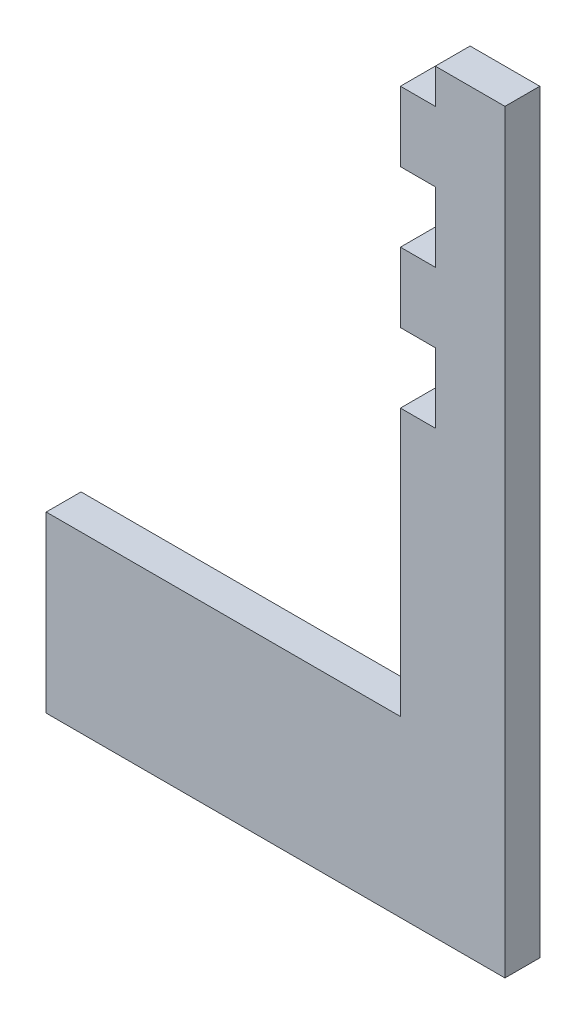
ISO-10303-21;
HEADER;
FILE_DESCRIPTION(('STEP AP214'),'2;1');
FILE_NAME('part.step','',(''),(''),'','','');
FILE_SCHEMA(('AUTOMOTIVE_DESIGN { 1 0 10303 214 1 1 1 1 }'));
ENDSEC;
DATA;
#1=APPLICATION_CONTEXT('core data for automotive mechanical design processes');
#2=APPLICATION_PROTOCOL_DEFINITION('international standard','automotive_design',2000,#1);
#3=PRODUCT_CONTEXT('',#1,'mechanical');
#4=PRODUCT('Part','Part','',(#3));
#5=PRODUCT_RELATED_PRODUCT_CATEGORY('part','',(#4));
#6=PRODUCT_DEFINITION_FORMATION('','',#4);
#7=PRODUCT_DEFINITION_CONTEXT('part definition',#1,'design');
#8=PRODUCT_DEFINITION('design','',#6,#7);
#9=PRODUCT_DEFINITION_SHAPE('','',#8);
#10=(LENGTH_UNIT() NAMED_UNIT(*) SI_UNIT(.MILLI.,.METRE.));
#11=(NAMED_UNIT(*) PLANE_ANGLE_UNIT() SI_UNIT($,.RADIAN.));
#12=(NAMED_UNIT(*) SI_UNIT($,.STERADIAN.) SOLID_ANGLE_UNIT());
#13=UNCERTAINTY_MEASURE_WITH_UNIT(LENGTH_MEASURE(1.E-05),#10,'distance_accuracy_value','');
#14=(GEOMETRIC_REPRESENTATION_CONTEXT(3) GLOBAL_UNCERTAINTY_ASSIGNED_CONTEXT((#13)) GLOBAL_UNIT_ASSIGNED_CONTEXT((#10,
#11,#12)) REPRESENTATION_CONTEXT('',''));
#15=CARTESIAN_POINT('',(0.,0.,0.));
#16=DIRECTION('',(0.,0.,1.));
#17=DIRECTION('',(1.,0.,0.));
#18=AXIS2_PLACEMENT_3D('',#15,#16,#17);
#19=CARTESIAN_POINT('',(61.,0.,6.));
#20=DIRECTION('',(-1.,0.,0.));
#21=DIRECTION('',(0.,0.,1.));
#22=AXIS2_PLACEMENT_3D('',#19,#20,#21);
#23=PLANE('',#22);
#24=DIRECTION('',(0.,0.,-1.));
#25=VECTOR('',#24,1.);
#26=CARTESIAN_POINT('',(61.,94.,6.001));
#27=LINE('',#26,#25);
#28=CARTESIAN_POINT('',(61.,94.,6.));
#29=VERTEX_POINT('',#28);
#30=CARTESIAN_POINT('',(61.,94.,0.));
#31=VERTEX_POINT('',#30);
#32=EDGE_CURVE('E157',#29,#31,#27,.T.);
#33=ORIENTED_EDGE('',*,*,#32,.T.);
#34=DIRECTION('',(0.,1.,0.));
#35=VECTOR('',#34,1.);
#36=CARTESIAN_POINT('',(61.,0.,0.));
#37=LINE('',#36,#35);
#38=CARTESIAN_POINT('',(60.9999999999998,82.,0.));
#39=VERTEX_POINT('',#38);
#40=EDGE_CURVE('E184',#39,#31,#37,.T.);
#41=ORIENTED_EDGE('',*,*,#40,.F.);
#42=DIRECTION('',(0.,0.,-1.));
#43=VECTOR('',#42,1.);
#44=CARTESIAN_POINT('',(60.9999999999998,82.,6.001));
#45=LINE('',#44,#43);
#46=CARTESIAN_POINT('',(61.,82.,6.));
#47=VERTEX_POINT('',#46);
#48=EDGE_CURVE('E254',#47,#39,#45,.T.);
#49=ORIENTED_EDGE('',*,*,#48,.F.);
#50=DIRECTION('',(0.,1.,0.));
#51=VECTOR('',#50,1.);
#52=CARTESIAN_POINT('',(61.,0.,6.));
#53=LINE('',#52,#51);
#54=EDGE_CURVE('E186',#47,#29,#53,.T.);
#55=ORIENTED_EDGE('',*,*,#54,.T.);
#56=EDGE_LOOP('',(#33,#41,#49,#55));
#57=FACE_BOUND('',#56,.T.);
#58=ADVANCED_FACE('F35',(#57),#23,.T.);
#59=DIRECTION('',(0.,0.,-1.));
#60=VECTOR('',#59,1.);
#61=CARTESIAN_POINT('',(60.9999999999998,70.,6.001));
#62=LINE('',#61,#60);
#63=CARTESIAN_POINT('',(61.,70.,6.));
#64=VERTEX_POINT('',#63);
#65=CARTESIAN_POINT('',(60.9999999999998,70.,0.));
#66=VERTEX_POINT('',#65);
#67=EDGE_CURVE('E251',#64,#66,#62,.T.);
#68=ORIENTED_EDGE('',*,*,#67,.T.);
#69=CARTESIAN_POINT('',(60.9999999999995,58.,0.));
#70=VERTEX_POINT('',#69);
#71=EDGE_CURVE('E183',#70,#66,#37,.T.);
#72=ORIENTED_EDGE('',*,*,#71,.F.);
#73=DIRECTION('',(0.,0.,-1.));
#74=VECTOR('',#73,1.);
#75=CARTESIAN_POINT('',(60.9999999999995,58.,6.001));
#76=LINE('',#75,#74);
#77=CARTESIAN_POINT('',(61.,58.,6.));
#78=VERTEX_POINT('',#77);
#79=EDGE_CURVE('E249',#78,#70,#76,.T.);
#80=ORIENTED_EDGE('',*,*,#79,.F.);
#81=EDGE_CURVE('E188',#78,#64,#53,.T.);
#82=ORIENTED_EDGE('',*,*,#81,.T.);
#83=EDGE_LOOP('',(#68,#72,#80,#82));
#84=FACE_BOUND('',#83,.T.);
#85=ADVANCED_FACE('F248',(#84),#23,.T.);
#86=DIRECTION('',(0.,0.,-1.));
#87=VECTOR('',#86,1.);
#88=CARTESIAN_POINT('',(60.9999999999995,46.,6.001));
#89=LINE('',#88,#87);
#90=CARTESIAN_POINT('',(61.,46.,6.));
#91=VERTEX_POINT('',#90);
#92=CARTESIAN_POINT('',(60.9999999999995,46.,0.));
#93=VERTEX_POINT('',#92);
#94=EDGE_CURVE('E199',#91,#93,#89,.T.);
#95=ORIENTED_EDGE('',*,*,#94,.T.);
#96=CARTESIAN_POINT('',(61.,0.,0.));
#97=VERTEX_POINT('',#96);
#98=EDGE_CURVE('E179',#97,#93,#37,.T.);
#99=ORIENTED_EDGE('',*,*,#98,.F.);
#100=DIRECTION('',(0.,0.,-1.));
#101=VECTOR('',#100,1.);
#102=CARTESIAN_POINT('',(61.,0.,6.));
#103=LINE('',#102,#101);
#104=CARTESIAN_POINT('',(61.,0.,6.));
#105=VERTEX_POINT('',#104);
#106=EDGE_CURVE('E11',#105,#97,#103,.T.);
#107=ORIENTED_EDGE('',*,*,#106,.F.);
#108=EDGE_CURVE('E175',#105,#91,#53,.T.);
#109=ORIENTED_EDGE('',*,*,#108,.T.);
#110=EDGE_LOOP('',(#95,#99,#107,#109));
#111=FACE_BOUND('',#110,.T.);
#112=ADVANCED_FACE('F37',(#111),#23,.T.);
#113=CARTESIAN_POINT('',(79.,0.,6.));
#114=DIRECTION('',(-1.,0.,0.));
#115=DIRECTION('',(0.,0.,1.));
#116=AXIS2_PLACEMENT_3D('',#113,#114,#115);
#117=PLANE('',#116);
#118=DIRECTION('',(0.,1.,0.));
#119=VECTOR('',#118,1.);
#120=CARTESIAN_POINT('',(79.,0.,0.));
#121=LINE('',#120,#119);
#122=CARTESIAN_POINT('',(79.,-30.,0.));
#123=VERTEX_POINT('',#122);
#124=CARTESIAN_POINT('',(79.,100.,0.));
#125=VERTEX_POINT('',#124);
#126=EDGE_CURVE('E182',#123,#125,#121,.T.);
#127=ORIENTED_EDGE('',*,*,#126,.T.);
#128=DIRECTION('',(0.,0.,-1.));
#129=VECTOR('',#128,1.);
#130=CARTESIAN_POINT('',(79.,100.,6.));
#131=LINE('',#130,#129);
#132=CARTESIAN_POINT('',(79.,100.,6.));
#133=VERTEX_POINT('',#132);
#134=EDGE_CURVE('E43',#133,#125,#131,.T.);
#135=ORIENTED_EDGE('',*,*,#134,.F.);
#136=DIRECTION('',(0.,1.,0.));
#137=VECTOR('',#136,1.);
#138=CARTESIAN_POINT('',(79.,0.,6.));
#139=LINE('',#138,#137);
#140=CARTESIAN_POINT('',(79.,-30.,6.));
#141=VERTEX_POINT('',#140);
#142=EDGE_CURVE('E172',#141,#133,#139,.T.);
#143=ORIENTED_EDGE('',*,*,#142,.F.);
#144=DIRECTION('',(0.,0.,-1.));
#145=VECTOR('',#144,1.);
#146=CARTESIAN_POINT('',(79.,-30.,6.));
#147=LINE('',#146,#145);
#148=EDGE_CURVE('E228',#141,#123,#147,.T.);
#149=ORIENTED_EDGE('',*,*,#148,.T.);
#150=EDGE_LOOP('',(#127,#135,#143,#149));
#151=FACE_BOUND('',#150,.T.);
#152=ADVANCED_FACE('F305',(#151),#117,.F.);
#153=CARTESIAN_POINT('',(0.,100.,6.));
#154=DIRECTION('',(0.,-1.,0.));
#155=DIRECTION('',(0.,0.,-1.));
#156=AXIS2_PLACEMENT_3D('',#153,#154,#155);
#157=PLANE('',#156);
#158=DIRECTION('',(-1.,0.,0.));
#159=VECTOR('',#158,1.);
#160=CARTESIAN_POINT('',(0.,100.,0.));
#161=LINE('',#160,#159);
#162=CARTESIAN_POINT('',(67.,100.,0.));
#163=VERTEX_POINT('',#162);
#164=EDGE_CURVE('E166',#125,#163,#161,.T.);
#165=ORIENTED_EDGE('',*,*,#164,.T.);
#166=DIRECTION('',(0.,0.,-1.));
#167=VECTOR('',#166,1.);
#168=CARTESIAN_POINT('',(67.,100.,6.001));
#169=LINE('',#168,#167);
#170=CARTESIAN_POINT('',(67.,100.,6.));
#171=VERTEX_POINT('',#170);
#172=EDGE_CURVE('E151',#171,#163,#169,.T.);
#173=ORIENTED_EDGE('',*,*,#172,.F.);
#174=DIRECTION('',(-1.,0.,0.));
#175=VECTOR('',#174,1.);
#176=CARTESIAN_POINT('',(0.,100.,6.));
#177=LINE('',#176,#175);
#178=EDGE_CURVE('E164',#133,#171,#177,.T.);
#179=ORIENTED_EDGE('',*,*,#178,.F.);
#180=ORIENTED_EDGE('',*,*,#134,.T.);
#181=EDGE_LOOP('',(#165,#173,#179,#180));
#182=FACE_BOUND('',#181,.T.);
#183=ADVANCED_FACE('F162',(#182),#157,.F.);
#184=CARTESIAN_POINT('',(0.,0.,6.));
#185=DIRECTION('',(0.,0.,1.));
#186=DIRECTION('',(1.,0.,0.));
#187=AXIS2_PLACEMENT_3D('',#184,#185,#186);
#188=PLANE('',#187);
#189=DIRECTION('',(0.,-1.,0.));
#190=VECTOR('',#189,1.);
#191=CARTESIAN_POINT('',(67.,106.,6.));
#192=LINE('',#191,#190);
#193=CARTESIAN_POINT('',(67.,94.,6.));
#194=VERTEX_POINT('',#193);
#195=EDGE_CURVE('E148',#171,#194,#192,.T.);
#196=ORIENTED_EDGE('',*,*,#195,.T.);
#197=DIRECTION('',(-1.,0.,0.));
#198=VECTOR('',#197,1.);
#199=CARTESIAN_POINT('',(61.,94.,6.));
#200=LINE('',#199,#198);
#201=EDGE_CURVE('E167',#194,#29,#200,.T.);
#202=ORIENTED_EDGE('',*,*,#201,.T.);
#203=ORIENTED_EDGE('',*,*,#54,.F.);
#204=DIRECTION('',(1.,0.,0.));
#205=VECTOR('',#204,1.);
#206=CARTESIAN_POINT('',(60.9999999999998,82.,6.));
#207=LINE('',#206,#205);
#208=CARTESIAN_POINT('',(66.9999999999998,82.,6.));
#209=VERTEX_POINT('',#208);
#210=EDGE_CURVE('E283',#47,#209,#207,.T.);
#211=ORIENTED_EDGE('',*,*,#210,.T.);
#212=DIRECTION('',(0.,-1.,0.));
#213=VECTOR('',#212,1.);
#214=CARTESIAN_POINT('',(66.9999999999998,82.,6.));
#215=LINE('',#214,#213);
#216=CARTESIAN_POINT('',(66.9999999999998,70.,6.));
#217=VERTEX_POINT('',#216);
#218=EDGE_CURVE('E168',#209,#217,#215,.T.);
#219=ORIENTED_EDGE('',*,*,#218,.T.);
#220=DIRECTION('',(-1.,0.,0.));
#221=VECTOR('',#220,1.);
#222=CARTESIAN_POINT('',(60.9999999999998,70.,6.));
#223=LINE('',#222,#221);
#224=EDGE_CURVE('E282',#217,#64,#223,.T.);
#225=ORIENTED_EDGE('',*,*,#224,.T.);
#226=ORIENTED_EDGE('',*,*,#81,.F.);
#227=DIRECTION('',(1.,0.,0.));
#228=VECTOR('',#227,1.);
#229=CARTESIAN_POINT('',(60.9999999999995,58.,6.));
#230=LINE('',#229,#228);
#231=CARTESIAN_POINT('',(66.9999999999995,58.,6.));
#232=VERTEX_POINT('',#231);
#233=EDGE_CURVE('E266',#78,#232,#230,.T.);
#234=ORIENTED_EDGE('',*,*,#233,.T.);
#235=DIRECTION('',(0.,-1.,0.));
#236=VECTOR('',#235,1.);
#237=CARTESIAN_POINT('',(66.9999999999995,58.,6.));
#238=LINE('',#237,#236);
#239=CARTESIAN_POINT('',(66.9999999999995,46.,6.));
#240=VERTEX_POINT('',#239);
#241=EDGE_CURVE('E277',#232,#240,#238,.T.);
#242=ORIENTED_EDGE('',*,*,#241,.T.);
#243=DIRECTION('',(-1.,0.,0.));
#244=VECTOR('',#243,1.);
#245=CARTESIAN_POINT('',(60.9999999999995,46.,6.));
#246=LINE('',#245,#244);
#247=EDGE_CURVE('E205',#240,#91,#246,.T.);
#248=ORIENTED_EDGE('',*,*,#247,.T.);
#249=ORIENTED_EDGE('',*,*,#108,.F.);
#250=DIRECTION('',(-1.,0.,0.));
#251=VECTOR('',#250,1.);
#252=CARTESIAN_POINT('',(0.,0.,6.));
#253=LINE('',#252,#251);
#254=CARTESIAN_POINT('',(0.,0.,6.));
#255=VERTEX_POINT('',#254);
#256=EDGE_CURVE('E202',#105,#255,#253,.T.);
#257=ORIENTED_EDGE('',*,*,#256,.T.);
#258=DIRECTION('',(0.,-1.,0.));
#259=VECTOR('',#258,1.);
#260=CARTESIAN_POINT('',(0.,0.,6.));
#261=LINE('',#260,#259);
#262=CARTESIAN_POINT('',(0.,-30.,6.));
#263=VERTEX_POINT('',#262);
#264=EDGE_CURVE('E212',#255,#263,#261,.T.);
#265=ORIENTED_EDGE('',*,*,#264,.T.);
#266=DIRECTION('',(1.,0.,0.));
#267=VECTOR('',#266,1.);
#268=CARTESIAN_POINT('',(0.,-30.,6.));
#269=LINE('',#268,#267);
#270=EDGE_CURVE('E213',#263,#141,#269,.T.);
#271=ORIENTED_EDGE('',*,*,#270,.T.);
#272=ORIENTED_EDGE('',*,*,#142,.T.);
#273=ORIENTED_EDGE('',*,*,#178,.T.);
#274=EDGE_LOOP('',(#196,#202,#203,#211,#219,#225,#226,#234,#242,#248,#249,#257,#265,#271,#272,#273));
#275=FACE_BOUND('',#274,.T.);
#276=ADVANCED_FACE('F170',(#275),#188,.T.);
#277=CARTESIAN_POINT('',(0.,0.,0.));
#278=DIRECTION('',(0.,0.,1.));
#279=DIRECTION('',(1.,0.,0.));
#280=AXIS2_PLACEMENT_3D('',#277,#278,#279);
#281=PLANE('',#280);
#282=DIRECTION('',(-1.,0.,0.));
#283=VECTOR('',#282,1.);
#284=CARTESIAN_POINT('',(61.,94.,0.));
#285=LINE('',#284,#283);
#286=CARTESIAN_POINT('',(67.,94.,0.));
#287=VERTEX_POINT('',#286);
#288=EDGE_CURVE('E298',#287,#31,#285,.T.);
#289=ORIENTED_EDGE('',*,*,#288,.F.);
#290=DIRECTION('',(0.,-1.,0.));
#291=VECTOR('',#290,1.);
#292=CARTESIAN_POINT('',(67.,106.,0.));
#293=LINE('',#292,#291);
#294=EDGE_CURVE('E50',#163,#287,#293,.T.);
#295=ORIENTED_EDGE('',*,*,#294,.F.);
#296=ORIENTED_EDGE('',*,*,#164,.F.);
#297=ORIENTED_EDGE('',*,*,#126,.F.);
#298=DIRECTION('',(1.,0.,0.));
#299=VECTOR('',#298,1.);
#300=CARTESIAN_POINT('',(0.,-30.,0.));
#301=LINE('',#300,#299);
#302=CARTESIAN_POINT('',(0.,-30.,0.));
#303=VERTEX_POINT('',#302);
#304=EDGE_CURVE('E156',#303,#123,#301,.T.);
#305=ORIENTED_EDGE('',*,*,#304,.F.);
#306=DIRECTION('',(0.,-1.,0.));
#307=VECTOR('',#306,1.);
#308=CARTESIAN_POINT('',(0.,0.,0.));
#309=LINE('',#308,#307);
#310=CARTESIAN_POINT('',(0.,0.,0.));
#311=VERTEX_POINT('',#310);
#312=EDGE_CURVE('E217',#311,#303,#309,.T.);
#313=ORIENTED_EDGE('',*,*,#312,.F.);
#314=DIRECTION('',(-1.,0.,0.));
#315=VECTOR('',#314,1.);
#316=CARTESIAN_POINT('',(0.,0.,0.));
#317=LINE('',#316,#315);
#318=EDGE_CURVE('E223',#97,#311,#317,.T.);
#319=ORIENTED_EDGE('',*,*,#318,.F.);
#320=ORIENTED_EDGE('',*,*,#98,.T.);
#321=DIRECTION('',(-1.,0.,0.));
#322=VECTOR('',#321,1.);
#323=CARTESIAN_POINT('',(60.9999999999995,46.,0.));
#324=LINE('',#323,#322);
#325=CARTESIAN_POINT('',(66.9999999999995,46.,0.));
#326=VERTEX_POINT('',#325);
#327=EDGE_CURVE('E273',#326,#93,#324,.T.);
#328=ORIENTED_EDGE('',*,*,#327,.F.);
#329=DIRECTION('',(0.,-1.,0.));
#330=VECTOR('',#329,1.);
#331=CARTESIAN_POINT('',(66.9999999999995,58.,0.));
#332=LINE('',#331,#330);
#333=CARTESIAN_POINT('',(66.9999999999995,58.,0.));
#334=VERTEX_POINT('',#333);
#335=EDGE_CURVE('E270',#334,#326,#332,.T.);
#336=ORIENTED_EDGE('',*,*,#335,.F.);
#337=DIRECTION('',(1.,0.,0.));
#338=VECTOR('',#337,1.);
#339=CARTESIAN_POINT('',(60.9999999999995,58.,0.));
#340=LINE('',#339,#338);
#341=EDGE_CURVE('E244',#70,#334,#340,.T.);
#342=ORIENTED_EDGE('',*,*,#341,.F.);
#343=ORIENTED_EDGE('',*,*,#71,.T.);
#344=DIRECTION('',(-1.,0.,0.));
#345=VECTOR('',#344,1.);
#346=CARTESIAN_POINT('',(60.9999999999998,70.,0.));
#347=LINE('',#346,#345);
#348=CARTESIAN_POINT('',(66.9999999999998,70.,0.));
#349=VERTEX_POINT('',#348);
#350=EDGE_CURVE('E242',#349,#66,#347,.T.);
#351=ORIENTED_EDGE('',*,*,#350,.F.);
#352=DIRECTION('',(0.,-1.,0.));
#353=VECTOR('',#352,1.);
#354=CARTESIAN_POINT('',(66.9999999999998,82.,0.));
#355=LINE('',#354,#353);
#356=CARTESIAN_POINT('',(66.9999999999998,82.,0.));
#357=VERTEX_POINT('',#356);
#358=EDGE_CURVE('E290',#357,#349,#355,.T.);
#359=ORIENTED_EDGE('',*,*,#358,.F.);
#360=DIRECTION('',(1.,0.,0.));
#361=VECTOR('',#360,1.);
#362=CARTESIAN_POINT('',(60.9999999999998,82.,0.));
#363=LINE('',#362,#361);
#364=EDGE_CURVE('E58',#39,#357,#363,.T.);
#365=ORIENTED_EDGE('',*,*,#364,.F.);
#366=ORIENTED_EDGE('',*,*,#40,.T.);
#367=EDGE_LOOP('',(#289,#295,#296,#297,#305,#313,#319,#320,#328,#336,#342,#343,#351,#359,#365,#366));
#368=FACE_BOUND('',#367,.T.);
#369=ADVANCED_FACE('F240',(#368),#281,.F.);
#370=CARTESIAN_POINT('',(0.,0.,6.));
#371=DIRECTION('',(0.,-1.,0.));
#372=DIRECTION('',(1.,0.,0.));
#373=AXIS2_PLACEMENT_3D('',#370,#371,#372);
#374=PLANE('',#373);
#375=ORIENTED_EDGE('',*,*,#256,.F.);
#376=ORIENTED_EDGE('',*,*,#106,.T.);
#377=ORIENTED_EDGE('',*,*,#318,.T.);
#378=DIRECTION('',(0.,0.,-1.));
#379=VECTOR('',#378,1.);
#380=CARTESIAN_POINT('',(0.,0.,6.));
#381=LINE('',#380,#379);
#382=EDGE_CURVE('E210',#255,#311,#381,.T.);
#383=ORIENTED_EDGE('',*,*,#382,.F.);
#384=EDGE_LOOP('',(#375,#376,#377,#383));
#385=FACE_BOUND('',#384,.T.);
#386=ADVANCED_FACE('F207',(#385),#374,.F.);
#387=CARTESIAN_POINT('',(0.,-30.,6.));
#388=DIRECTION('',(0.,1.,0.));
#389=DIRECTION('',(0.,0.,1.));
#390=AXIS2_PLACEMENT_3D('',#387,#388,#389);
#391=PLANE('',#390);
#392=ORIENTED_EDGE('',*,*,#304,.T.);
#393=ORIENTED_EDGE('',*,*,#148,.F.);
#394=ORIENTED_EDGE('',*,*,#270,.F.);
#395=DIRECTION('',(0.,0.,-1.));
#396=VECTOR('',#395,1.);
#397=CARTESIAN_POINT('',(0.,-30.,6.));
#398=LINE('',#397,#396);
#399=EDGE_CURVE('E215',#263,#303,#398,.T.);
#400=ORIENTED_EDGE('',*,*,#399,.T.);
#401=EDGE_LOOP('',(#392,#393,#394,#400));
#402=FACE_BOUND('',#401,.T.);
#403=ADVANCED_FACE('F309',(#402),#391,.F.);
#404=CARTESIAN_POINT('',(0.,0.,6.));
#405=DIRECTION('',(1.,0.,0.));
#406=DIRECTION('',(0.,1.,0.));
#407=AXIS2_PLACEMENT_3D('',#404,#405,#406);
#408=PLANE('',#407);
#409=ORIENTED_EDGE('',*,*,#312,.T.);
#410=ORIENTED_EDGE('',*,*,#399,.F.);
#411=ORIENTED_EDGE('',*,*,#264,.F.);
#412=ORIENTED_EDGE('',*,*,#382,.T.);
#413=EDGE_LOOP('',(#409,#410,#411,#412));
#414=FACE_BOUND('',#413,.T.);
#415=ADVANCED_FACE('F311',(#414),#408,.F.);
#416=CARTESIAN_POINT('',(60.9999999999995,58.,6.001));
#417=DIRECTION('',(0.,1.,0.));
#418=DIRECTION('',(0.,0.,1.));
#419=AXIS2_PLACEMENT_3D('',#416,#417,#418);
#420=PLANE('',#419);
#421=ORIENTED_EDGE('',*,*,#79,.T.);
#422=ORIENTED_EDGE('',*,*,#341,.T.);
#423=DIRECTION('',(0.,0.,-1.));
#424=VECTOR('',#423,1.);
#425=CARTESIAN_POINT('',(66.9999999999995,58.,6.001));
#426=LINE('',#425,#424);
#427=EDGE_CURVE('E275',#232,#334,#426,.T.);
#428=ORIENTED_EDGE('',*,*,#427,.F.);
#429=ORIENTED_EDGE('',*,*,#233,.F.);
#430=EDGE_LOOP('',(#421,#422,#428,#429));
#431=FACE_BOUND('',#430,.T.);
#432=ADVANCED_FACE('F320',(#431),#420,.F.);
#433=CARTESIAN_POINT('',(60.9999999999995,46.,6.001));
#434=DIRECTION('',(0.,-1.,0.));
#435=DIRECTION('',(0.,0.,-1.));
#436=AXIS2_PLACEMENT_3D('',#433,#434,#435);
#437=PLANE('',#436);
#438=DIRECTION('',(0.,0.,-1.));
#439=VECTOR('',#438,1.);
#440=CARTESIAN_POINT('',(66.9999999999995,46.,6.001));
#441=LINE('',#440,#439);
#442=EDGE_CURVE('E279',#240,#326,#441,.T.);
#443=ORIENTED_EDGE('',*,*,#442,.T.);
#444=ORIENTED_EDGE('',*,*,#327,.T.);
#445=ORIENTED_EDGE('',*,*,#94,.F.);
#446=ORIENTED_EDGE('',*,*,#247,.F.);
#447=EDGE_LOOP('',(#443,#444,#445,#446));
#448=FACE_BOUND('',#447,.T.);
#449=ADVANCED_FACE('F314',(#448),#437,.F.);
#450=CARTESIAN_POINT('',(66.9999999999995,58.,6.001));
#451=DIRECTION('',(1.,0.,0.));
#452=DIRECTION('',(0.,0.,-1.));
#453=AXIS2_PLACEMENT_3D('',#450,#451,#452);
#454=PLANE('',#453);
#455=ORIENTED_EDGE('',*,*,#427,.T.);
#456=ORIENTED_EDGE('',*,*,#335,.T.);
#457=ORIENTED_EDGE('',*,*,#442,.F.);
#458=ORIENTED_EDGE('',*,*,#241,.F.);
#459=EDGE_LOOP('',(#455,#456,#457,#458));
#460=FACE_BOUND('',#459,.T.);
#461=ADVANCED_FACE('F317',(#460),#454,.F.);
#462=CARTESIAN_POINT('',(60.9999999999998,82.,6.001));
#463=DIRECTION('',(0.,1.,0.));
#464=DIRECTION('',(0.,0.,1.));
#465=AXIS2_PLACEMENT_3D('',#462,#463,#464);
#466=PLANE('',#465);
#467=ORIENTED_EDGE('',*,*,#48,.T.);
#468=ORIENTED_EDGE('',*,*,#364,.T.);
#469=DIRECTION('',(0.,0.,-1.));
#470=VECTOR('',#469,1.);
#471=CARTESIAN_POINT('',(66.9999999999998,82.,6.001));
#472=LINE('',#471,#470);
#473=EDGE_CURVE('E258',#209,#357,#472,.T.);
#474=ORIENTED_EDGE('',*,*,#473,.F.);
#475=ORIENTED_EDGE('',*,*,#210,.F.);
#476=EDGE_LOOP('',(#467,#468,#474,#475));
#477=FACE_BOUND('',#476,.T.);
#478=ADVANCED_FACE('F417',(#477),#466,.F.);
#479=CARTESIAN_POINT('',(60.9999999999998,70.,6.001));
#480=DIRECTION('',(0.,-1.,0.));
#481=DIRECTION('',(0.,0.,-1.));
#482=AXIS2_PLACEMENT_3D('',#479,#480,#481);
#483=PLANE('',#482);
#484=DIRECTION('',(0.,0.,-1.));
#485=VECTOR('',#484,1.);
#486=CARTESIAN_POINT('',(66.9999999999998,70.,6.001));
#487=LINE('',#486,#485);
#488=EDGE_CURVE('E255',#217,#349,#487,.T.);
#489=ORIENTED_EDGE('',*,*,#488,.T.);
#490=ORIENTED_EDGE('',*,*,#350,.T.);
#491=ORIENTED_EDGE('',*,*,#67,.F.);
#492=ORIENTED_EDGE('',*,*,#224,.F.);
#493=EDGE_LOOP('',(#489,#490,#491,#492));
#494=FACE_BOUND('',#493,.T.);
#495=ADVANCED_FACE('F292',(#494),#483,.F.);
#496=CARTESIAN_POINT('',(66.9999999999998,82.,6.001));
#497=DIRECTION('',(1.,0.,0.));
#498=DIRECTION('',(0.,0.,-1.));
#499=AXIS2_PLACEMENT_3D('',#496,#497,#498);
#500=PLANE('',#499);
#501=ORIENTED_EDGE('',*,*,#473,.T.);
#502=ORIENTED_EDGE('',*,*,#358,.T.);
#503=ORIENTED_EDGE('',*,*,#488,.F.);
#504=ORIENTED_EDGE('',*,*,#218,.F.);
#505=EDGE_LOOP('',(#501,#502,#503,#504));
#506=FACE_BOUND('',#505,.T.);
#507=ADVANCED_FACE('F295',(#506),#500,.F.);
#508=CARTESIAN_POINT('',(67.,106.,6.001));
#509=DIRECTION('',(1.,0.,0.));
#510=DIRECTION('',(0.,0.,-1.));
#511=AXIS2_PLACEMENT_3D('',#508,#509,#510);
#512=PLANE('',#511);
#513=ORIENTED_EDGE('',*,*,#172,.T.);
#514=ORIENTED_EDGE('',*,*,#294,.T.);
#515=DIRECTION('',(0.,0.,-1.));
#516=VECTOR('',#515,1.);
#517=CARTESIAN_POINT('',(67.,94.,6.001));
#518=LINE('',#517,#516);
#519=EDGE_CURVE('E152',#194,#287,#518,.T.);
#520=ORIENTED_EDGE('',*,*,#519,.F.);
#521=ORIENTED_EDGE('',*,*,#195,.F.);
#522=EDGE_LOOP('',(#513,#514,#520,#521));
#523=FACE_BOUND('',#522,.T.);
#524=ADVANCED_FACE('F150',(#523),#512,.F.);
#525=CARTESIAN_POINT('',(61.,94.,6.001));
#526=DIRECTION('',(0.,-1.,0.));
#527=DIRECTION('',(0.,0.,-1.));
#528=AXIS2_PLACEMENT_3D('',#525,#526,#527);
#529=PLANE('',#528);
#530=ORIENTED_EDGE('',*,*,#519,.T.);
#531=ORIENTED_EDGE('',*,*,#288,.T.);
#532=ORIENTED_EDGE('',*,*,#32,.F.);
#533=ORIENTED_EDGE('',*,*,#201,.F.);
#534=EDGE_LOOP('',(#530,#531,#532,#533));
#535=FACE_BOUND('',#534,.T.);
#536=ADVANCED_FACE('F302',(#535),#529,.F.);
#537=CLOSED_SHELL('',(#58,#85,#112,#152,#183,#276,#369,#386,#403,#415,#432,#449,#461,#478,#495,
#507,#524,#536));
#538=MANIFOLD_SOLID_BREP('B2',#537);
#539=ADVANCED_BREP_SHAPE_REPRESENTATION('',(#18,#538),#14);
#540=SHAPE_DEFINITION_REPRESENTATION(#9,#539);
ENDSEC;
END-ISO-10303-21;
